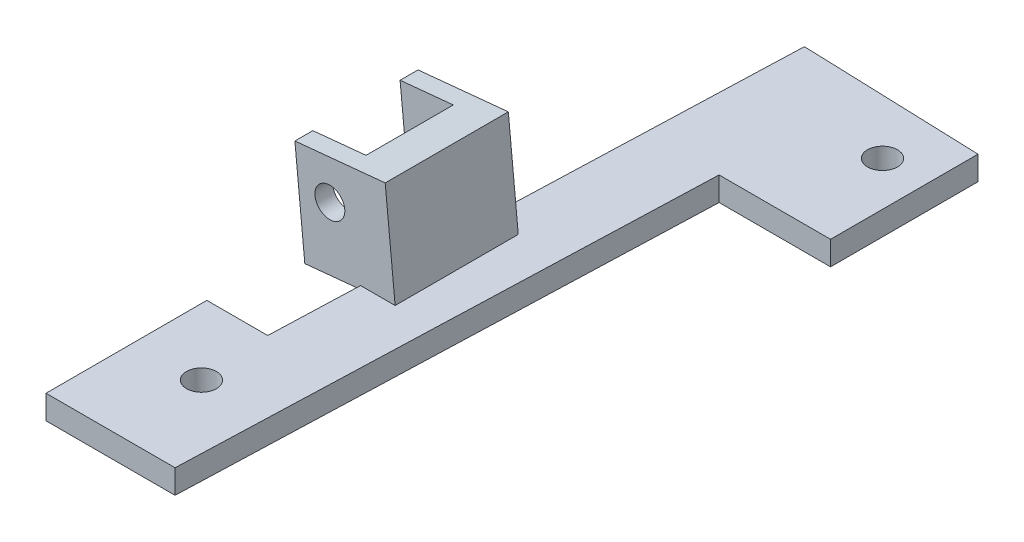
ISO-10303-21;
HEADER;
FILE_DESCRIPTION(('STEP AP214'),'2;1');
FILE_NAME('part.step','',(''),(''),'','','');
FILE_SCHEMA(('AUTOMOTIVE_DESIGN { 1 0 10303 214 1 1 1 1 }'));
ENDSEC;
DATA;
#1=APPLICATION_CONTEXT('core data for automotive mechanical design processes');
#2=APPLICATION_PROTOCOL_DEFINITION('international standard','automotive_design',2000,#1);
#3=PRODUCT_CONTEXT('',#1,'mechanical');
#4=PRODUCT('Part','Part','',(#3));
#5=PRODUCT_RELATED_PRODUCT_CATEGORY('part','',(#4));
#6=PRODUCT_DEFINITION_FORMATION('','',#4);
#7=PRODUCT_DEFINITION_CONTEXT('part definition',#1,'design');
#8=PRODUCT_DEFINITION('design','',#6,#7);
#9=PRODUCT_DEFINITION_SHAPE('','',#8);
#10=(LENGTH_UNIT() NAMED_UNIT(*) SI_UNIT(.MILLI.,.METRE.));
#11=(NAMED_UNIT(*) PLANE_ANGLE_UNIT() SI_UNIT($,.RADIAN.));
#12=(NAMED_UNIT(*) SI_UNIT($,.STERADIAN.) SOLID_ANGLE_UNIT());
#13=UNCERTAINTY_MEASURE_WITH_UNIT(LENGTH_MEASURE(1.E-05),#10,'distance_accuracy_value','');
#14=(GEOMETRIC_REPRESENTATION_CONTEXT(3) GLOBAL_UNCERTAINTY_ASSIGNED_CONTEXT((#13)) GLOBAL_UNIT_ASSIGNED_CONTEXT((#10,
#11,#12)) REPRESENTATION_CONTEXT('',''));
#15=CARTESIAN_POINT('',(0.,0.,0.));
#16=DIRECTION('',(0.,0.,1.));
#17=DIRECTION('',(1.,0.,0.));
#18=AXIS2_PLACEMENT_3D('',#15,#16,#17);
#19=CARTESIAN_POINT('',(484.354931301938,150.999999999998,-22.352));
#20=DIRECTION('',(0.,0.,1.));
#21=DIRECTION('',(1.,0.,0.));
#22=AXIS2_PLACEMENT_3D('',#19,#20,#21);
#23=CYLINDRICAL_SURFACE('',#22,9.52499999999996);
#24=CARTESIAN_POINT('',(484.354931301938,150.999999999998,-18.542));
#25=DIRECTION('',(0.,0.,-1.));
#26=DIRECTION('',(-1.,0.,0.));
#27=AXIS2_PLACEMENT_3D('',#24,#25,#26);
#28=CIRCLE('',#27,9.52499999999996);
#29=CARTESIAN_POINT('',(485.284620904235,141.520479851626,-18.542));
#30=VERTEX_POINT('',#29);
#31=CARTESIAN_POINT('',(488.231748541954,159.700339825977,-18.542));
#32=VERTEX_POINT('',#31);
#33=EDGE_CURVE('E286',#30,#32,#28,.F.);
#34=ORIENTED_EDGE('',*,*,#33,.F.);
#35=DIRECTION('',(0.,0.,1.));
#36=VECTOR('',#35,1.);
#37=CARTESIAN_POINT('',(485.284620904235,141.520479851626,-22.352));
#38=LINE('',#37,#36);
#39=CARTESIAN_POINT('',(485.284620904235,141.520479851626,0.));
#40=VERTEX_POINT('',#39);
#41=EDGE_CURVE('E308',#30,#40,#38,.T.);
#42=ORIENTED_EDGE('',*,*,#41,.T.);
#43=CARTESIAN_POINT('',(484.354931301938,150.999999999998,0.));
#44=DIRECTION('',(0.,0.,1.));
#45=DIRECTION('',(1.,0.,0.));
#46=AXIS2_PLACEMENT_3D('',#43,#44,#45);
#47=CIRCLE('',#46,9.52499999999996);
#48=CARTESIAN_POINT('',(488.231748541954,159.700339825977,4.44089209850063E-13));
#49=VERTEX_POINT('',#48);
#50=EDGE_CURVE('E295',#40,#49,#47,.T.);
#51=ORIENTED_EDGE('',*,*,#50,.T.);
#52=DIRECTION('',(0.,0.,1.));
#53=VECTOR('',#52,1.);
#54=CARTESIAN_POINT('',(488.231748541954,159.700339825977,-22.3519999999996));
#55=LINE('',#54,#53);
#56=EDGE_CURVE('E313',#32,#49,#55,.T.);
#57=ORIENTED_EDGE('',*,*,#56,.F.);
#58=EDGE_LOOP('',(#34,#42,#51,#57));
#59=FACE_BOUND('',#58,.T.);
#60=ADVANCED_FACE('F41',(#59),#23,.F.);
#61=CARTESIAN_POINT('',(-9.12398287906912,93.0321037493748,-22.352));
#62=DIRECTION('',(-0.0976052075901502,0.99522521242746,0.));
#63=DIRECTION('',(-0.99522521242746,-0.0976052075901502,0.));
#64=AXIS2_PLACEMENT_3D('',#61,#62,#63);
#65=PLANE('',#64);
#66=ORIENTED_EDGE('',*,*,#41,.F.);
#67=DIRECTION('',(0.995225212427461,0.0976052075901502,0.));
#68=VECTOR('',#67,1.);
#69=CARTESIAN_POINT('',(-9.12398287906916,93.0321037493748,-18.542));
#70=LINE('',#69,#68);
#71=CARTESIAN_POINT('',(478.661596160572,140.870936716155,-18.542));
#72=VERTEX_POINT('',#71);
#73=EDGE_CURVE('E288',#72,#30,#70,.T.);
#74=ORIENTED_EDGE('',*,*,#73,.F.);
#75=DIRECTION('',(0.,0.,1.));
#76=VECTOR('',#75,1.);
#77=CARTESIAN_POINT('',(478.661596160572,140.870936716155,-22.352));
#78=LINE('',#77,#76);
#79=CARTESIAN_POINT('',(478.661596160572,140.870936716155,0.));
#80=VERTEX_POINT('',#79);
#81=EDGE_CURVE('E322',#72,#80,#78,.T.);
#82=ORIENTED_EDGE('',*,*,#81,.T.);
#83=DIRECTION('',(-0.995225212427461,-0.0976052075901502,0.));
#84=VECTOR('',#83,1.);
#85=CARTESIAN_POINT('',(-9.12398287906912,93.0321037493748,0.));
#86=LINE('',#85,#84);
#87=EDGE_CURVE('E300',#40,#80,#86,.T.);
#88=ORIENTED_EDGE('',*,*,#87,.F.);
#89=EDGE_LOOP('',(#66,#74,#82,#88));
#90=FACE_BOUND('',#89,.T.);
#91=ADVANCED_FACE('F375',(#90),#65,.T.);
#92=CARTESIAN_POINT('',(-10.861882642295,110.752486746728,-22.352));
#93=DIRECTION('',(-0.0976052075901548,0.99522521242746,0.));
#94=DIRECTION('',(-0.99522521242746,-0.0976052075901548,0.));
#95=AXIS2_PLACEMENT_3D('',#92,#93,#94);
#96=PLANE('',#95);
#97=ORIENTED_EDGE('',*,*,#56,.T.);
#98=DIRECTION('',(-0.99522521242746,-0.0976052075901565,0.));
#99=VECTOR('',#98,1.);
#100=CARTESIAN_POINT('',(-10.8618826422952,110.752486746728,0.));
#101=LINE('',#100,#99);
#102=CARTESIAN_POINT('',(476.923696397346,158.591319713511,0.));
#103=VERTEX_POINT('',#102);
#104=EDGE_CURVE('E272',#49,#103,#101,.T.);
#105=ORIENTED_EDGE('',*,*,#104,.T.);
#106=DIRECTION('',(0.,0.,-1.));
#107=VECTOR('',#106,1.);
#108=CARTESIAN_POINT('',(476.923696397346,158.591319713511,3.81));
#109=LINE('',#108,#107);
#110=CARTESIAN_POINT('',(476.923696397346,158.591319713511,3.81));
#111=VERTEX_POINT('',#110);
#112=EDGE_CURVE('E269',#111,#103,#109,.T.);
#113=ORIENTED_EDGE('',*,*,#112,.F.);
#114=DIRECTION('',(-0.99522521242746,-0.0976052075901565,0.));
#115=VECTOR('',#114,1.);
#116=CARTESIAN_POINT('',(-10.8618826422952,110.752486746728,3.81));
#117=LINE('',#116,#115);
#118=CARTESIAN_POINT('',(496.114951182073,160.473473002825,3.81));
#119=VERTEX_POINT('',#118);
#120=EDGE_CURVE('E261',#119,#111,#117,.T.);
#121=ORIENTED_EDGE('',*,*,#120,.F.);
#122=DIRECTION('',(0.,0.,1.));
#123=VECTOR('',#122,1.);
#124=CARTESIAN_POINT('',(496.114951182073,160.473473002825,-22.352));
#125=LINE('',#124,#123);
#126=CARTESIAN_POINT('',(496.114951182073,160.473473002825,-22.352));
#127=VERTEX_POINT('',#126);
#128=EDGE_CURVE('E315',#127,#119,#125,.T.);
#129=ORIENTED_EDGE('',*,*,#128,.F.);
#130=DIRECTION('',(-0.99522521242746,-0.0976052075901548,0.));
#131=VECTOR('',#130,1.);
#132=CARTESIAN_POINT('',(-10.861882642295,110.752486746728,-22.352));
#133=LINE('',#132,#131);
#134=CARTESIAN_POINT('',(476.923696397346,158.591319713511,-22.352));
#135=VERTEX_POINT('',#134);
#136=EDGE_CURVE('E305',#127,#135,#133,.T.);
#137=ORIENTED_EDGE('',*,*,#136,.T.);
#138=DIRECTION('',(0.,0.,-1.));
#139=VECTOR('',#138,1.);
#140=CARTESIAN_POINT('',(476.923696397346,158.591319713511,-18.542));
#141=LINE('',#140,#139);
#142=CARTESIAN_POINT('',(476.923696397346,158.591319713511,-18.542));
#143=VERTEX_POINT('',#142);
#144=EDGE_CURVE('E290',#143,#135,#141,.T.);
#145=ORIENTED_EDGE('',*,*,#144,.F.);
#146=DIRECTION('',(-0.99522521242746,-0.0976052075901545,0.));
#147=VECTOR('',#146,1.);
#148=CARTESIAN_POINT('',(-10.8618826422951,110.752486746729,-18.542));
#149=LINE('',#148,#147);
#150=EDGE_CURVE('E284',#32,#143,#149,.T.);
#151=ORIENTED_EDGE('',*,*,#150,.F.);
#152=EDGE_LOOP('',(#97,#105,#113,#121,#129,#137,#145,#151));
#153=FACE_BOUND('',#152,.T.);
#154=ADVANCED_FACE('F365',(#153),#96,.T.);
#155=CARTESIAN_POINT('',(506.976833824368,49.7209862560963,-22.352));
#156=DIRECTION('',(0.99522521242746,0.0976052075901537,0.));
#157=DIRECTION('',(-0.0976052075901537,0.99522521242746,0.));
#158=AXIS2_PLACEMENT_3D('',#155,#156,#157);
#159=PLANE('',#158);
#160=ORIENTED_EDGE('',*,*,#128,.T.);
#161=DIRECTION('',(-0.0976052075901537,0.99522521242746,0.));
#162=VECTOR('',#161,1.);
#163=CARTESIAN_POINT('',(506.976833824368,49.7209862560963,3.81));
#164=LINE('',#163,#162);
#165=CARTESIAN_POINT('',(498.224726786217,138.961281946121,3.81));
#166=VERTEX_POINT('',#165);
#167=EDGE_CURVE('E257',#166,#119,#164,.T.);
#168=ORIENTED_EDGE('',*,*,#167,.F.);
#169=DIRECTION('',(0.,0.,1.));
#170=VECTOR('',#169,1.);
#171=CARTESIAN_POINT('',(498.224726786217,138.961281946121,-22.3520000000004));
#172=LINE('',#171,#170);
#173=CARTESIAN_POINT('',(498.224726786217,138.961281946121,-22.3520000000004));
#174=VERTEX_POINT('',#173);
#175=EDGE_CURVE('E317',#174,#166,#172,.T.);
#176=ORIENTED_EDGE('',*,*,#175,.F.);
#177=DIRECTION('',(-0.0976052075901537,0.99522521242746,0.));
#178=VECTOR('',#177,1.);
#179=CARTESIAN_POINT('',(506.976833824368,49.7209862560963,-22.352));
#180=LINE('',#179,#178);
#181=EDGE_CURVE('E302',#174,#127,#180,.T.);
#182=ORIENTED_EDGE('',*,*,#181,.T.);
#183=EDGE_LOOP('',(#160,#168,#176,#182));
#184=FACE_BOUND('',#183,.T.);
#185=ADVANCED_FACE('F408',(#184),#159,.T.);
#186=CARTESIAN_POINT('',(-8.75210703815077,89.2402956900246,-22.352));
#187=DIRECTION('',(0.0976052075901534,-0.99522521242746,0.));
#188=DIRECTION('',(0.99522521242746,0.0976052075901534,0.));
#189=AXIS2_PLACEMENT_3D('',#186,#187,#188);
#190=PLANE('',#189);
#191=DIRECTION('',(0.035071956284052,0.00343962907184407,-0.999378870516211));
#192=VECTOR('',#191,1.);
#193=CARTESIAN_POINT('',(491.171206664464,138.269518627499,-4.6390670309464));
#194=LINE('',#193,#192);
#195=CARTESIAN_POINT('',(490.874697184133,138.240438908638,3.81));
#196=VERTEX_POINT('',#195);
#197=CARTESIAN_POINT('',(491.792819977573,138.330482413091,-22.352));
#198=VERTEX_POINT('',#197);
#199=EDGE_CURVE('E249',#196,#198,#194,.T.);
#200=ORIENTED_EDGE('',*,*,#199,.F.);
#201=DIRECTION('',(0.99522521242746,0.0976052075901534,0.));
#202=VECTOR('',#201,1.);
#203=CARTESIAN_POINT('',(-8.75210703815082,89.2402956900246,3.81));
#204=LINE('',#203,#202);
#205=CARTESIAN_POINT('',(479.033472001491,137.079128656807,3.81));
#206=VERTEX_POINT('',#205);
#207=EDGE_CURVE('E266',#206,#196,#204,.T.);
#208=ORIENTED_EDGE('',*,*,#207,.F.);
#209=DIRECTION('',(0.,0.,1.));
#210=VECTOR('',#209,1.);
#211=CARTESIAN_POINT('',(479.033472001491,137.079128656807,-22.352));
#212=LINE('',#211,#210);
#213=CARTESIAN_POINT('',(479.033472001491,137.079128656807,-22.352));
#214=VERTEX_POINT('',#213);
#215=EDGE_CURVE('E320',#214,#206,#212,.T.);
#216=ORIENTED_EDGE('',*,*,#215,.F.);
#217=DIRECTION('',(0.99522521242746,0.0976052075901534,0.));
#218=VECTOR('',#217,1.);
#219=CARTESIAN_POINT('',(-8.75210703815077,89.2402956900246,-22.352));
#220=LINE('',#219,#218);
#221=EDGE_CURVE('E299',#214,#198,#220,.T.);
#222=ORIENTED_EDGE('',*,*,#221,.T.);
#223=EDGE_LOOP('',(#200,#208,#216,#222));
#224=FACE_BOUND('',#223,.T.);
#225=ADVANCED_FACE('F350',(#224),#190,.T.);
#226=CARTESIAN_POINT('',(487.785579039642,47.8388329667822,-22.352));
#227=DIRECTION('',(-0.99522521242746,-0.0976052075901538,0.));
#228=DIRECTION('',(0.0976052075901538,-0.99522521242746,0.));
#229=AXIS2_PLACEMENT_3D('',#226,#227,#228);
#230=PLANE('',#229);
#231=ORIENTED_EDGE('',*,*,#215,.T.);
#232=DIRECTION('',(0.0976052075901615,-0.995225212427459,0.));
#233=VECTOR('',#232,1.);
#234=CARTESIAN_POINT('',(487.785579039642,47.838832966786,3.81));
#235=LINE('',#234,#233);
#236=EDGE_CURVE('E263',#111,#206,#235,.T.);
#237=ORIENTED_EDGE('',*,*,#236,.F.);
#238=ORIENTED_EDGE('',*,*,#112,.T.);
#239=DIRECTION('',(0.0976052075901615,-0.995225212427459,0.));
#240=VECTOR('',#239,1.);
#241=CARTESIAN_POINT('',(487.785579039642,47.838832966786,0.));
#242=LINE('',#241,#240);
#243=EDGE_CURVE('E258',#103,#80,#242,.T.);
#244=ORIENTED_EDGE('',*,*,#243,.T.);
#245=ORIENTED_EDGE('',*,*,#81,.F.);
#246=DIRECTION('',(0.0976052075901549,-0.99522521242746,0.));
#247=VECTOR('',#246,1.);
#248=CARTESIAN_POINT('',(487.785579039642,47.8388329667827,-18.542));
#249=LINE('',#248,#247);
#250=EDGE_CURVE('E282',#143,#72,#249,.T.);
#251=ORIENTED_EDGE('',*,*,#250,.F.);
#252=ORIENTED_EDGE('',*,*,#144,.T.);
#253=DIRECTION('',(0.0976052075901538,-0.99522521242746,0.));
#254=VECTOR('',#253,1.);
#255=CARTESIAN_POINT('',(487.785579039642,47.8388329667822,-22.352));
#256=LINE('',#255,#254);
#257=EDGE_CURVE('E296',#135,#214,#256,.T.);
#258=ORIENTED_EDGE('',*,*,#257,.T.);
#259=EDGE_LOOP('',(#231,#237,#238,#244,#245,#251,#252,#258));
#260=FACE_BOUND('',#259,.T.);
#261=ADVANCED_FACE('F358',(#260),#230,.T.);
#262=CARTESIAN_POINT('',(0.,0.,-22.352));
#263=DIRECTION('',(0.,0.,1.));
#264=DIRECTION('',(1.,0.,0.));
#265=AXIS2_PLACEMENT_3D('',#262,#263,#264);
#266=PLANE('',#265);
#267=DIRECTION('',(-1.,0.,0.));
#268=VECTOR('',#267,1.);
#269=CARTESIAN_POINT('',(0.,138.961281946121,-22.352));
#270=LINE('',#269,#268);
#271=CARTESIAN_POINT('',(491.792819977573,138.961281946121,-22.352));
#272=VERTEX_POINT('',#271);
#273=EDGE_CURVE('E57',#174,#272,#270,.T.);
#274=ORIENTED_EDGE('',*,*,#273,.T.);
#275=DIRECTION('',(0.,-1.,0.));
#276=VECTOR('',#275,1.);
#277=CARTESIAN_POINT('',(491.792819977573,-3.70275009174436E-13,-22.352));
#278=LINE('',#277,#276);
#279=EDGE_CURVE('E61',#272,#198,#278,.T.);
#280=ORIENTED_EDGE('',*,*,#279,.T.);
#281=ORIENTED_EDGE('',*,*,#221,.F.);
#282=ORIENTED_EDGE('',*,*,#257,.F.);
#283=ORIENTED_EDGE('',*,*,#136,.F.);
#284=ORIENTED_EDGE('',*,*,#181,.F.);
#285=EDGE_LOOP('',(#274,#280,#281,#282,#283,#284));
#286=FACE_BOUND('',#285,.T.);
#287=CARTESIAN_POINT('',(484.354931301938,150.999999999998,-22.352));
#288=DIRECTION('',(0.,0.,-1.));
#289=DIRECTION('',(-1.,0.,0.));
#290=AXIS2_PLACEMENT_3D('',#287,#288,#289);
#291=CIRCLE('',#290,3.17499999999997);
#292=CARTESIAN_POINT('',(484.354931301938,154.174999999998,-22.352));
#293=VERTEX_POINT('',#292);
#294=EDGE_CURVE('E278',#293,#293,#291,.T.);
#295=ORIENTED_EDGE('',*,*,#294,.F.);
#296=EDGE_LOOP('',(#295));
#297=FACE_BOUND('',#296,.T.);
#298=ADVANCED_FACE('F360',(#286,#297),#266,.F.);
#299=CARTESIAN_POINT('',(484.354931301938,150.999999999998,-18.542));
#300=DIRECTION('',(0.,0.,-1.));
#301=DIRECTION('',(0.,1.,0.));
#302=AXIS2_PLACEMENT_3D('',#299,#300,#301);
#303=CYLINDRICAL_SURFACE('',#302,3.17499999999997);
#304=CARTESIAN_POINT('',(484.354931301938,150.999999999998,-18.542));
#305=DIRECTION('',(0.,0.,-1.));
#306=DIRECTION('',(-1.,0.,0.));
#307=AXIS2_PLACEMENT_3D('',#304,#305,#306);
#308=CIRCLE('',#307,3.17499999999997);
#309=CARTESIAN_POINT('',(484.354931301938,154.174999999998,-18.542));
#310=VERTEX_POINT('',#309);
#311=EDGE_CURVE('E279',#310,#310,#308,.T.);
#312=CARTESIAN_POINT('',(484.354931301938,154.174999999998,-18.542));
#313=CARTESIAN_POINT('',(484.354931301938,154.174999999998,-18.5816875));
#314=CARTESIAN_POINT('',(484.354931301938,154.174999999998,-18.621375));
#315=CARTESIAN_POINT('',(484.354931301938,154.174999999998,-18.70075));
#316=CARTESIAN_POINT('',(484.354931301938,154.174999999998,-18.7404375));
#317=CARTESIAN_POINT('',(484.354931301938,154.174999999998,-18.8198125));
#318=CARTESIAN_POINT('',(484.354931301938,154.174999999998,-18.8595));
#319=CARTESIAN_POINT('',(484.354931301938,154.174999999998,-18.938875));
#320=CARTESIAN_POINT('',(484.354931301938,154.174999999998,-18.9785625));
#321=CARTESIAN_POINT('',(484.354931301938,154.174999999998,-19.0579375));
#322=CARTESIAN_POINT('',(484.354931301938,154.174999999998,-19.097625));
#323=CARTESIAN_POINT('',(484.354931301938,154.174999999998,-19.177));
#324=CARTESIAN_POINT('',(484.354931301938,154.174999999998,-19.2166875));
#325=CARTESIAN_POINT('',(484.354931301938,154.174999999998,-19.2960625));
#326=CARTESIAN_POINT('',(484.354931301938,154.174999999998,-19.33575));
#327=CARTESIAN_POINT('',(484.354931301938,154.174999999998,-19.415125));
#328=CARTESIAN_POINT('',(484.354931301938,154.174999999998,-19.4548125));
#329=CARTESIAN_POINT('',(484.354931301938,154.174999999998,-19.5341875));
#330=CARTESIAN_POINT('',(484.354931301938,154.174999999998,-19.573875));
#331=CARTESIAN_POINT('',(484.354931301938,154.174999999998,-19.65325));
#332=CARTESIAN_POINT('',(484.354931301938,154.174999999998,-19.6929375));
#333=CARTESIAN_POINT('',(484.354931301938,154.174999999998,-19.7723125));
#334=CARTESIAN_POINT('',(484.354931301938,154.174999999998,-19.812));
#335=CARTESIAN_POINT('',(484.354931301938,154.174999999998,-19.891375));
#336=CARTESIAN_POINT('',(484.354931301938,154.174999999998,-19.9310625));
#337=CARTESIAN_POINT('',(484.354931301938,154.174999999998,-20.0104375));
#338=CARTESIAN_POINT('',(484.354931301938,154.174999999998,-20.050125));
#339=CARTESIAN_POINT('',(484.354931301938,154.174999999998,-20.1295));
#340=CARTESIAN_POINT('',(484.354931301938,154.174999999998,-20.1691875));
#341=CARTESIAN_POINT('',(484.354931301938,154.174999999998,-20.2485625));
#342=CARTESIAN_POINT('',(484.354931301938,154.174999999998,-20.28825));
#343=CARTESIAN_POINT('',(484.354931301938,154.174999999998,-20.367625));
#344=CARTESIAN_POINT('',(484.354931301938,154.174999999998,-20.4073125));
#345=CARTESIAN_POINT('',(484.354931301938,154.174999999998,-20.4866875));
#346=CARTESIAN_POINT('',(484.354931301938,154.174999999998,-20.526375));
#347=CARTESIAN_POINT('',(484.354931301938,154.174999999998,-20.60575));
#348=CARTESIAN_POINT('',(484.354931301938,154.174999999998,-20.6454375));
#349=CARTESIAN_POINT('',(484.354931301938,154.174999999998,-20.7248125));
#350=CARTESIAN_POINT('',(484.354931301938,154.174999999998,-20.7645));
#351=CARTESIAN_POINT('',(484.354931301938,154.174999999998,-20.843875));
#352=CARTESIAN_POINT('',(484.354931301938,154.174999999998,-20.8835625));
#353=CARTESIAN_POINT('',(484.354931301938,154.174999999998,-20.9629375));
#354=CARTESIAN_POINT('',(484.354931301938,154.174999999998,-21.002625));
#355=CARTESIAN_POINT('',(484.354931301938,154.174999999998,-21.082));
#356=CARTESIAN_POINT('',(484.354931301938,154.174999999998,-21.1216875));
#357=CARTESIAN_POINT('',(484.354931301938,154.174999999998,-21.2010625));
#358=CARTESIAN_POINT('',(484.354931301938,154.174999999998,-21.24075));
#359=CARTESIAN_POINT('',(484.354931301938,154.174999999998,-21.320125));
#360=CARTESIAN_POINT('',(484.354931301938,154.174999999998,-21.3598125));
#361=CARTESIAN_POINT('',(484.354931301938,154.174999999998,-21.4391875));
#362=CARTESIAN_POINT('',(484.354931301938,154.174999999998,-21.478875));
#363=CARTESIAN_POINT('',(484.354931301938,154.174999999998,-21.55825));
#364=CARTESIAN_POINT('',(484.354931301938,154.174999999998,-21.5979375));
#365=CARTESIAN_POINT('',(484.354931301938,154.174999999998,-21.6773125));
#366=CARTESIAN_POINT('',(484.354931301938,154.174999999998,-21.717));
#367=CARTESIAN_POINT('',(484.354931301938,154.174999999998,-21.796375));
#368=CARTESIAN_POINT('',(484.354931301938,154.174999999998,-21.8360625));
#369=CARTESIAN_POINT('',(484.354931301938,154.174999999998,-21.9154375));
#370=CARTESIAN_POINT('',(484.354931301938,154.174999999998,-21.955125));
#371=CARTESIAN_POINT('',(484.354931301938,154.174999999998,-22.0345));
#372=CARTESIAN_POINT('',(484.354931301938,154.174999999998,-22.0741875));
#373=CARTESIAN_POINT('',(484.354931301938,154.174999999998,-22.1535625));
#374=CARTESIAN_POINT('',(484.354931301938,154.174999999998,-22.19325));
#375=CARTESIAN_POINT('',(484.354931301938,154.174999999998,-22.272625));
#376=CARTESIAN_POINT('',(484.354931301938,154.174999999998,-22.3123125));
#377=CARTESIAN_POINT('',(484.354931301938,154.174999999998,-22.352));
#378=B_SPLINE_CURVE_WITH_KNOTS('',3,(#312,#313,#314,#315,#316,#317,#318,#319,#320,#321,#322,
#323,#324,#325,#326,#327,#328,#329,#330,#331,#332,#333,#334,#335,#336,#337,#338,#339,#340,#341,
#342,#343,#344,#345,#346,#347,#348,#349,#350,#351,#352,#353,#354,#355,#356,#357,#358,#359,#360,
#361,#362,#363,#364,#365,#366,#367,#368,#369,#370,#371,#372,#373,#374,#375,#376,#377),
.UNSPECIFIED.,.F.,.F.,(4,2,2,2,2,2,2,2,2,2,2,2,2,2,2,2,2,2,2,2,2,2,2,2,2,2,2,2,2,2,2,2,4),(0.,
0.119062500000003,0.238125000000002,0.357187500000002,0.476250000000001,0.5953125,
0.714375000000003,0.833437500000003,0.952500000000002,1.0715625,1.190625,1.3096875,1.42875,
1.5478125,1.666875,1.7859375,1.905,2.0240625,2.143125,2.2621875,2.38125,2.5003125,2.619375,
2.7384375,2.8575,2.9765625,3.095625,3.2146875,3.33375,3.4528125,3.571875,3.6909375,3.81),.UNSPECIFIED.);
#379=EDGE_CURVE('BSEAM398',#310,#293,#378,.T.);
#380=ORIENTED_EDGE('',*,*,#311,.F.);
#381=ORIENTED_EDGE('',*,*,#294,.T.);
#382=ORIENTED_EDGE('',*,*,#379,.T.);
#383=ORIENTED_EDGE('',*,*,#379,.F.);
#384=EDGE_LOOP('',(#380,#382,#381,#383));
#385=FACE_BOUND('',#384,.T.);
#386=ADVANCED_FACE('F398',(#385),#303,.F.);
#387=CARTESIAN_POINT('',(0.,0.,-18.542));
#388=DIRECTION('',(0.,0.,-1.));
#389=DIRECTION('',(-1.,0.,0.));
#390=AXIS2_PLACEMENT_3D('',#387,#388,#389);
#391=PLANE('',#390);
#392=ORIENTED_EDGE('',*,*,#311,.T.);
#393=EDGE_LOOP('',(#392));
#394=FACE_BOUND('',#393,.T.);
#395=ORIENTED_EDGE('',*,*,#250,.T.);
#396=ORIENTED_EDGE('',*,*,#73,.T.);
#397=ORIENTED_EDGE('',*,*,#33,.T.);
#398=ORIENTED_EDGE('',*,*,#150,.T.);
#399=EDGE_LOOP('',(#395,#396,#397,#398));
#400=FACE_BOUND('',#399,.T.);
#401=ADVANCED_FACE('F371',(#394,#400),#391,.F.);
#402=CARTESIAN_POINT('',(484.354931301938,150.999999999998,3.81));
#403=DIRECTION('',(0.,0.,-1.));
#404=DIRECTION('',(-1.,0.,0.));
#405=AXIS2_PLACEMENT_3D('',#402,#403,#404);
#406=CYLINDRICAL_SURFACE('',#405,3.17499999999997);
#407=CARTESIAN_POINT('',(484.354931301938,150.999999999998,3.81));
#408=DIRECTION('',(0.,0.,1.));
#409=DIRECTION('',(1.,0.,0.));
#410=AXIS2_PLACEMENT_3D('',#407,#408,#409);
#411=CIRCLE('',#410,3.17499999999997);
#412=CARTESIAN_POINT('',(481.179931301938,150.999999999998,3.81));
#413=VERTEX_POINT('',#412);
#414=EDGE_CURVE('E254',#413,#413,#411,.T.);
#415=CARTESIAN_POINT('',(484.354931301938,150.999999999998,0.));
#416=DIRECTION('',(0.,0.,1.));
#417=DIRECTION('',(1.,0.,0.));
#418=AXIS2_PLACEMENT_3D('',#415,#416,#417);
#419=CIRCLE('',#418,3.17499999999997);
#420=CARTESIAN_POINT('',(481.179931301938,150.999999999998,0.));
#421=VERTEX_POINT('',#420);
#422=EDGE_CURVE('E253',#421,#421,#419,.T.);
#423=CARTESIAN_POINT('',(481.179931301938,150.999999999998,3.81));
#424=CARTESIAN_POINT('',(481.179931301938,150.999999999998,3.7703125));
#425=CARTESIAN_POINT('',(481.179931301938,150.999999999998,3.730625));
#426=CARTESIAN_POINT('',(481.179931301938,150.999999999998,3.65125));
#427=CARTESIAN_POINT('',(481.179931301938,150.999999999998,3.6115625));
#428=CARTESIAN_POINT('',(481.179931301938,150.999999999998,3.5321875));
#429=CARTESIAN_POINT('',(481.179931301938,150.999999999998,3.4925));
#430=CARTESIAN_POINT('',(481.179931301938,150.999999999998,3.413125));
#431=CARTESIAN_POINT('',(481.179931301938,150.999999999998,3.3734375));
#432=CARTESIAN_POINT('',(481.179931301938,150.999999999998,3.2940625));
#433=CARTESIAN_POINT('',(481.179931301938,150.999999999998,3.254375));
#434=CARTESIAN_POINT('',(481.179931301938,150.999999999998,3.175));
#435=CARTESIAN_POINT('',(481.179931301938,150.999999999998,3.1353125));
#436=CARTESIAN_POINT('',(481.179931301938,150.999999999998,3.0559375));
#437=CARTESIAN_POINT('',(481.179931301938,150.999999999998,3.01625));
#438=CARTESIAN_POINT('',(481.179931301938,150.999999999998,2.936875));
#439=CARTESIAN_POINT('',(481.179931301938,150.999999999998,2.8971875));
#440=CARTESIAN_POINT('',(481.179931301938,150.999999999998,2.8178125));
#441=CARTESIAN_POINT('',(481.179931301938,150.999999999998,2.778125));
#442=CARTESIAN_POINT('',(481.179931301938,150.999999999998,2.69875));
#443=CARTESIAN_POINT('',(481.179931301938,150.999999999998,2.6590625));
#444=CARTESIAN_POINT('',(481.179931301938,150.999999999998,2.5796875));
#445=CARTESIAN_POINT('',(481.179931301938,150.999999999998,2.54));
#446=CARTESIAN_POINT('',(481.179931301938,150.999999999998,2.460625));
#447=CARTESIAN_POINT('',(481.179931301938,150.999999999998,2.4209375));
#448=CARTESIAN_POINT('',(481.179931301938,150.999999999998,2.3415625));
#449=CARTESIAN_POINT('',(481.179931301938,150.999999999998,2.301875));
#450=CARTESIAN_POINT('',(481.179931301938,150.999999999998,2.2225));
#451=CARTESIAN_POINT('',(481.179931301938,150.999999999998,2.1828125));
#452=CARTESIAN_POINT('',(481.179931301938,150.999999999998,2.1034375));
#453=CARTESIAN_POINT('',(481.179931301938,150.999999999998,2.06375));
#454=CARTESIAN_POINT('',(481.179931301938,150.999999999998,1.984375));
#455=CARTESIAN_POINT('',(481.179931301938,150.999999999998,1.9446875));
#456=CARTESIAN_POINT('',(481.179931301938,150.999999999998,1.8653125));
#457=CARTESIAN_POINT('',(481.179931301938,150.999999999998,1.825625));
#458=CARTESIAN_POINT('',(481.179931301938,150.999999999998,1.74625));
#459=CARTESIAN_POINT('',(481.179931301938,150.999999999998,1.7065625));
#460=CARTESIAN_POINT('',(481.179931301938,150.999999999998,1.6271875));
#461=CARTESIAN_POINT('',(481.179931301938,150.999999999998,1.5875));
#462=CARTESIAN_POINT('',(481.179931301938,150.999999999998,1.508125));
#463=CARTESIAN_POINT('',(481.179931301938,150.999999999998,1.4684375));
#464=CARTESIAN_POINT('',(481.179931301938,150.999999999998,1.3890625));
#465=CARTESIAN_POINT('',(481.179931301938,150.999999999998,1.349375));
#466=CARTESIAN_POINT('',(481.179931301938,150.999999999998,1.27));
#467=CARTESIAN_POINT('',(481.179931301938,150.999999999998,1.2303125));
#468=CARTESIAN_POINT('',(481.179931301938,150.999999999998,1.1509375));
#469=CARTESIAN_POINT('',(481.179931301938,150.999999999998,1.11125));
#470=CARTESIAN_POINT('',(481.179931301938,150.999999999998,1.031875));
#471=CARTESIAN_POINT('',(481.179931301938,150.999999999998,0.9921875));
#472=CARTESIAN_POINT('',(481.179931301938,150.999999999998,0.9128125));
#473=CARTESIAN_POINT('',(481.179931301938,150.999999999998,0.873125));
#474=CARTESIAN_POINT('',(481.179931301938,150.999999999998,0.79375));
#475=CARTESIAN_POINT('',(481.179931301938,150.999999999998,0.7540625));
#476=CARTESIAN_POINT('',(481.179931301938,150.999999999998,0.6746875));
#477=CARTESIAN_POINT('',(481.179931301938,150.999999999998,0.635));
#478=CARTESIAN_POINT('',(481.179931301938,150.999999999998,0.555625));
#479=CARTESIAN_POINT('',(481.179931301938,150.999999999998,0.5159375));
#480=CARTESIAN_POINT('',(481.179931301938,150.999999999998,0.4365625));
#481=CARTESIAN_POINT('',(481.179931301938,150.999999999998,0.396875));
#482=CARTESIAN_POINT('',(481.179931301938,150.999999999998,0.3175));
#483=CARTESIAN_POINT('',(481.179931301938,150.999999999998,0.2778125));
#484=CARTESIAN_POINT('',(481.179931301938,150.999999999998,0.1984375));
#485=CARTESIAN_POINT('',(481.179931301938,150.999999999998,0.15875));
#486=CARTESIAN_POINT('',(481.179931301938,150.999999999998,0.0793749999999999));
#487=CARTESIAN_POINT('',(481.179931301938,150.999999999998,0.0396874999999999));
#488=CARTESIAN_POINT('',(481.179931301938,150.999999999998,0.));
#489=B_SPLINE_CURVE_WITH_KNOTS('',3,(#423,#424,#425,#426,#427,#428,#429,#430,#431,#432,#433,
#434,#435,#436,#437,#438,#439,#440,#441,#442,#443,#444,#445,#446,#447,#448,#449,#450,#451,#452,
#453,#454,#455,#456,#457,#458,#459,#460,#461,#462,#463,#464,#465,#466,#467,#468,#469,#470,#471,
#472,#473,#474,#475,#476,#477,#478,#479,#480,#481,#482,#483,#484,#485,#486,#487,#488),
.UNSPECIFIED.,.F.,.F.,(4,2,2,2,2,2,2,2,2,2,2,2,2,2,2,2,2,2,2,2,2,2,2,2,2,2,2,2,2,2,2,2,4),(0.,
0.1190625,0.238125,0.3571875,0.47625,0.595312499999999,0.714375,0.833437499999999,
0.952499999999999,1.0715625,1.190625,1.3096875,1.42875,1.5478125,1.666875,1.7859375,1.905,
2.0240625,2.143125,2.2621875,2.38125,2.5003125,2.619375,2.7384375,2.8575,2.9765625,3.095625,
3.2146875,3.33375,3.4528125,3.571875,3.6909375,3.81),.UNSPECIFIED.);
#490=EDGE_CURVE('BSEAM388',#413,#421,#489,.T.);
#491=ORIENTED_EDGE('',*,*,#414,.T.);
#492=ORIENTED_EDGE('',*,*,#422,.F.);
#493=ORIENTED_EDGE('',*,*,#490,.T.);
#494=ORIENTED_EDGE('',*,*,#490,.F.);
#495=EDGE_LOOP('',(#491,#493,#492,#494));
#496=FACE_BOUND('',#495,.T.);
#497=ADVANCED_FACE('F388',(#496),#406,.F.);
#498=CARTESIAN_POINT('',(0.,0.,3.81));
#499=DIRECTION('',(0.,0.,1.));
#500=DIRECTION('',(1.,0.,0.));
#501=AXIS2_PLACEMENT_3D('',#498,#499,#500);
#502=PLANE('',#501);
#503=DIRECTION('',(0.,-1.,0.));
#504=VECTOR('',#503,1.);
#505=CARTESIAN_POINT('',(490.874697184133,-3.69583746691629E-13,3.81));
#506=LINE('',#505,#504);
#507=CARTESIAN_POINT('',(490.874697184133,138.961281946121,3.81));
#508=VERTEX_POINT('',#507);
#509=EDGE_CURVE('E11',#508,#196,#506,.T.);
#510=ORIENTED_EDGE('',*,*,#509,.F.);
#511=DIRECTION('',(-1.,0.,0.));
#512=VECTOR('',#511,1.);
#513=CARTESIAN_POINT('',(0.,138.961281946121,3.81));
#514=LINE('',#513,#512);
#515=EDGE_CURVE('E49',#166,#508,#514,.T.);
#516=ORIENTED_EDGE('',*,*,#515,.F.);
#517=ORIENTED_EDGE('',*,*,#167,.T.);
#518=ORIENTED_EDGE('',*,*,#120,.T.);
#519=ORIENTED_EDGE('',*,*,#236,.T.);
#520=ORIENTED_EDGE('',*,*,#207,.T.);
#521=EDGE_LOOP('',(#510,#516,#517,#518,#519,#520));
#522=FACE_BOUND('',#521,.T.);
#523=ORIENTED_EDGE('',*,*,#414,.F.);
#524=EDGE_LOOP('',(#523));
#525=FACE_BOUND('',#524,.T.);
#526=ADVANCED_FACE('F352',(#522,#525),#502,.T.);
#527=CARTESIAN_POINT('',(0.,0.,0.));
#528=DIRECTION('',(0.,0.,1.));
#529=DIRECTION('',(1.,0.,0.));
#530=AXIS2_PLACEMENT_3D('',#527,#528,#529);
#531=PLANE('',#530);
#532=ORIENTED_EDGE('',*,*,#50,.F.);
#533=ORIENTED_EDGE('',*,*,#87,.T.);
#534=ORIENTED_EDGE('',*,*,#243,.F.);
#535=ORIENTED_EDGE('',*,*,#104,.F.);
#536=EDGE_LOOP('',(#532,#533,#534,#535));
#537=FACE_BOUND('',#536,.T.);
#538=ORIENTED_EDGE('',*,*,#422,.T.);
#539=EDGE_LOOP('',(#538));
#540=FACE_BOUND('',#539,.T.);
#541=ADVANCED_FACE('F382',(#537,#540),#531,.F.);
#542=CARTESIAN_POINT('',(494.072487043271,133.881281946121,-87.3113389892222));
#543=DIRECTION('',(-0.999384782418439,0.,-0.0350721637548947));
#544=DIRECTION('',(-0.0350721637548947,0.,0.999384782418439));
#545=AXIS2_PLACEMENT_3D('',#542,#543,#544);
#546=PLANE('',#545);
#547=ORIENTED_EDGE('',*,*,#279,.F.);
#548=DIRECTION('',(-0.0350721637548947,0.,0.999384782418439));
#549=VECTOR('',#548,1.);
#550=CARTESIAN_POINT('',(494.072487043271,138.961281946121,-87.3113389892222));
#551=LINE('',#550,#549);
#552=CARTESIAN_POINT('',(494.072487043271,138.961281946121,-87.3113389892222));
#553=VERTEX_POINT('',#552);
#554=EDGE_CURVE('E217',#553,#272,#551,.T.);
#555=ORIENTED_EDGE('',*,*,#554,.F.);
#556=DIRECTION('',(0.,1.,0.));
#557=VECTOR('',#556,1.);
#558=CARTESIAN_POINT('',(494.072487043271,133.881281946121,-87.3113389892222));
#559=LINE('',#558,#557);
#560=CARTESIAN_POINT('',(494.072487043271,133.881281946121,-87.3113389892222));
#561=VERTEX_POINT('',#560);
#562=EDGE_CURVE('E193',#561,#553,#559,.T.);
#563=ORIENTED_EDGE('',*,*,#562,.F.);
#564=DIRECTION('',(-0.0350721637548947,0.,0.999384782418439));
#565=VECTOR('',#564,1.);
#566=CARTESIAN_POINT('',(494.072487043271,133.881281946121,-87.3113389892222));
#567=LINE('',#566,#565);
#568=CARTESIAN_POINT('',(490.206161169492,133.881281946121,22.8599999999999));
#569=VERTEX_POINT('',#568);
#570=EDGE_CURVE('E185',#561,#569,#567,.T.);
#571=ORIENTED_EDGE('',*,*,#570,.T.);
#572=DIRECTION('',(0.,1.,0.));
#573=VECTOR('',#572,1.);
#574=CARTESIAN_POINT('',(490.206161169492,133.881281946121,22.8599999999999));
#575=LINE('',#574,#573);
#576=CARTESIAN_POINT('',(490.206161169492,138.961281946121,22.8599999999999));
#577=VERTEX_POINT('',#576);
#578=EDGE_CURVE('E168',#569,#577,#575,.T.);
#579=ORIENTED_EDGE('',*,*,#578,.T.);
#580=EDGE_CURVE('E220',#508,#577,#551,.T.);
#581=ORIENTED_EDGE('',*,*,#580,.F.);
#582=ORIENTED_EDGE('',*,*,#509,.T.);
#583=ORIENTED_EDGE('',*,*,#199,.T.);
#584=EDGE_LOOP('',(#547,#555,#563,#571,#579,#581,#582,#583));
#585=FACE_BOUND('',#584,.T.);
#586=ADVANCED_FACE('F191',(#585),#546,.T.);
#587=CARTESIAN_POINT('',(0.,138.961281946121,3.88158721593413E-13));
#588=DIRECTION('',(0.,1.,0.));
#589=DIRECTION('',(0.,0.,1.));
#590=AXIS2_PLACEMENT_3D('',#587,#588,#589);
#591=PLANE('',#590);
#592=CARTESIAN_POINT('',(491.366130703707,138.961281946121,38.1050659351772));
#593=DIRECTION('',(0.,1.,0.));
#594=DIRECTION('',(0.,0.,1.));
#595=AXIS2_PLACEMENT_3D('',#592,#593,#594);
#596=CIRCLE('',#595,3.17500000000009);
#597=CARTESIAN_POINT('',(491.366130703707,138.961281946121,41.2800659351773));
#598=VERTEX_POINT('',#597);
#599=EDGE_CURVE('E328',#598,#598,#596,.T.);
#600=ORIENTED_EDGE('',*,*,#599,.F.);
#601=EDGE_LOOP('',(#600));
#602=FACE_BOUND('',#601,.T.);
#603=CARTESIAN_POINT('',(522.917143490395,138.961281946121,-75.0491676662665));
#604=DIRECTION('',(0.,1.,0.));
#605=DIRECTION('',(0.,0.,1.));
#606=AXIS2_PLACEMENT_3D('',#603,#604,#605);
#607=CIRCLE('',#606,3.17500000000008);
#608=CARTESIAN_POINT('',(522.917143490395,138.961281946121,-71.8741676662665));
#609=VERTEX_POINT('',#608);
#610=EDGE_CURVE('E200',#609,#609,#607,.T.);
#611=ORIENTED_EDGE('',*,*,#610,.F.);
#612=EDGE_LOOP('',(#611));
#613=FACE_BOUND('',#612,.T.);
#614=ORIENTED_EDGE('',*,*,#273,.F.);
#615=ORIENTED_EDGE('',*,*,#175,.T.);
#616=ORIENTED_EDGE('',*,*,#515,.T.);
#617=ORIENTED_EDGE('',*,*,#580,.T.);
#618=DIRECTION('',(-1.,0.,0.));
#619=VECTOR('',#618,1.);
#620=CARTESIAN_POINT('',(477.269374413565,138.961281946121,22.8599999999999));
#621=LINE('',#620,#619);
#622=CARTESIAN_POINT('',(477.269374413565,138.961281946121,22.8599999999999));
#623=VERTEX_POINT('',#622);
#624=EDGE_CURVE('E173',#577,#623,#621,.T.);
#625=ORIENTED_EDGE('',*,*,#624,.T.);
#626=DIRECTION('',(0.,0.,1.));
#627=VECTOR('',#626,1.);
#628=CARTESIAN_POINT('',(477.269374413565,138.961281946121,57.0385291686839));
#629=LINE('',#628,#627);
#630=CARTESIAN_POINT('',(477.269374413565,138.961281946121,57.0385291686839));
#631=VERTEX_POINT('',#630);
#632=EDGE_CURVE('E222',#623,#631,#629,.T.);
#633=ORIENTED_EDGE('',*,*,#632,.T.);
#634=DIRECTION('',(1.,0.,0.));
#635=VECTOR('',#634,1.);
#636=CARTESIAN_POINT('',(504.692489503563,138.961281946121,57.0385291686839));
#637=LINE('',#636,#635);
#638=CARTESIAN_POINT('',(504.692489503563,138.961281946121,57.0385291686839));
#639=VERTEX_POINT('',#638);
#640=EDGE_CURVE('E225',#631,#639,#637,.T.);
#641=ORIENTED_EDGE('',*,*,#640,.T.);
#642=DIRECTION('',(0.0350721637548938,0.,-0.999384782418439));
#643=VECTOR('',#642,1.);
#644=CARTESIAN_POINT('',(508.611718184172,138.961281946121,-54.6402805446749));
#645=LINE('',#644,#643);
#646=CARTESIAN_POINT('',(508.611718184172,138.961281946121,-54.6402805446749));
#647=VERTEX_POINT('',#646);
#648=EDGE_CURVE('E228',#639,#647,#645,.T.);
#649=ORIENTED_EDGE('',*,*,#648,.T.);
#650=DIRECTION('',(1.,0.,0.));
#651=VECTOR('',#650,1.);
#652=CARTESIAN_POINT('',(532.291432121368,138.961281946121,-54.6402805446749));
#653=LINE('',#652,#651);
#654=CARTESIAN_POINT('',(532.291432121368,138.961281946121,-54.6402805446749));
#655=VERTEX_POINT('',#654);
#656=EDGE_CURVE('E231',#647,#655,#653,.T.);
#657=ORIENTED_EDGE('',*,*,#656,.T.);
#658=DIRECTION('',(0.,0.,-1.));
#659=VECTOR('',#658,1.);
#660=CARTESIAN_POINT('',(532.291432121368,138.961281946121,-85.9700927306245));
#661=LINE('',#660,#659);
#662=CARTESIAN_POINT('',(532.291432121368,138.961281946121,-85.9700927306245));
#663=VERTEX_POINT('',#662);
#664=EDGE_CURVE('E197',#655,#663,#661,.T.);
#665=ORIENTED_EDGE('',*,*,#664,.T.);
#666=DIRECTION('',(-0.999384782418439,0.,-0.0350721637548908));
#667=VECTOR('',#666,1.);
#668=CARTESIAN_POINT('',(494.072487043271,138.961281946121,-87.3113389892222));
#669=LINE('',#668,#667);
#670=EDGE_CURVE('E194',#663,#553,#669,.T.);
#671=ORIENTED_EDGE('',*,*,#670,.T.);
#672=ORIENTED_EDGE('',*,*,#554,.T.);
#673=EDGE_LOOP('',(#614,#615,#616,#617,#625,#633,#641,#649,#657,#665,#671,#672));
#674=FACE_BOUND('',#673,.T.);
#675=ADVANCED_FACE('F341',(#602,#613,#674),#591,.T.);
#676=CARTESIAN_POINT('',(494.072487043271,133.881281946121,-87.3113389892222));
#677=DIRECTION('',(0.0350721637548908,0.,-0.999384782418439));
#678=DIRECTION('',(-0.999384782418439,0.,-0.0350721637548908));
#679=AXIS2_PLACEMENT_3D('',#676,#677,#678);
#680=PLANE('',#679);
#681=ORIENTED_EDGE('',*,*,#670,.F.);
#682=DIRECTION('',(0.,1.,0.));
#683=VECTOR('',#682,1.);
#684=CARTESIAN_POINT('',(532.291432121368,133.881281946121,-85.9700927306245));
#685=LINE('',#684,#683);
#686=CARTESIAN_POINT('',(532.291432121368,133.881281946121,-85.9700927306245));
#687=VERTEX_POINT('',#686);
#688=EDGE_CURVE('E237',#687,#663,#685,.T.);
#689=ORIENTED_EDGE('',*,*,#688,.F.);
#690=DIRECTION('',(-0.999384782418439,0.,-0.0350721637548908));
#691=VECTOR('',#690,1.);
#692=CARTESIAN_POINT('',(494.072487043271,133.881281946121,-87.3113389892222));
#693=LINE('',#692,#691);
#694=EDGE_CURVE('E178',#687,#561,#693,.T.);
#695=ORIENTED_EDGE('',*,*,#694,.T.);
#696=ORIENTED_EDGE('',*,*,#562,.T.);
#697=EDGE_LOOP('',(#681,#689,#695,#696));
#698=FACE_BOUND('',#697,.T.);
#699=ADVANCED_FACE('F344',(#698),#680,.T.);
#700=CARTESIAN_POINT('',(532.291432121368,133.881281946121,-85.9700927306245));
#701=DIRECTION('',(1.,0.,0.));
#702=DIRECTION('',(0.,1.,0.));
#703=AXIS2_PLACEMENT_3D('',#700,#701,#702);
#704=PLANE('',#703);
#705=ORIENTED_EDGE('',*,*,#664,.F.);
#706=DIRECTION('',(0.,1.,0.));
#707=VECTOR('',#706,1.);
#708=CARTESIAN_POINT('',(532.291432121368,133.881281946121,-54.6402805446749));
#709=LINE('',#708,#707);
#710=CARTESIAN_POINT('',(532.291432121368,133.881281946121,-54.6402805446749));
#711=VERTEX_POINT('',#710);
#712=EDGE_CURVE('E239',#711,#655,#709,.T.);
#713=ORIENTED_EDGE('',*,*,#712,.F.);
#714=DIRECTION('',(0.,0.,-1.));
#715=VECTOR('',#714,1.);
#716=CARTESIAN_POINT('',(532.291432121368,133.881281946121,-85.9700927306245));
#717=LINE('',#716,#715);
#718=EDGE_CURVE('E213',#711,#687,#717,.T.);
#719=ORIENTED_EDGE('',*,*,#718,.T.);
#720=ORIENTED_EDGE('',*,*,#688,.T.);
#721=EDGE_LOOP('',(#705,#713,#719,#720));
#722=FACE_BOUND('',#721,.T.);
#723=ADVANCED_FACE('F529',(#722),#704,.T.);
#724=CARTESIAN_POINT('',(532.291432121368,133.881281946121,-54.6402805446749));
#725=DIRECTION('',(0.,0.,1.));
#726=DIRECTION('',(0.,-1.,0.));
#727=AXIS2_PLACEMENT_3D('',#724,#725,#726);
#728=PLANE('',#727);
#729=ORIENTED_EDGE('',*,*,#656,.F.);
#730=DIRECTION('',(0.,1.,0.));
#731=VECTOR('',#730,1.);
#732=CARTESIAN_POINT('',(508.611718184172,133.881281946121,-54.6402805446749));
#733=LINE('',#732,#731);
#734=CARTESIAN_POINT('',(508.611718184172,133.881281946121,-54.6402805446749));
#735=VERTEX_POINT('',#734);
#736=EDGE_CURVE('E241',#735,#647,#733,.T.);
#737=ORIENTED_EDGE('',*,*,#736,.F.);
#738=DIRECTION('',(1.,0.,0.));
#739=VECTOR('',#738,1.);
#740=CARTESIAN_POINT('',(532.291432121368,133.881281946121,-54.6402805446749));
#741=LINE('',#740,#739);
#742=EDGE_CURVE('E210',#735,#711,#741,.T.);
#743=ORIENTED_EDGE('',*,*,#742,.T.);
#744=ORIENTED_EDGE('',*,*,#712,.T.);
#745=EDGE_LOOP('',(#729,#737,#743,#744));
#746=FACE_BOUND('',#745,.T.);
#747=ADVANCED_FACE('F539',(#746),#728,.T.);
#748=CARTESIAN_POINT('',(508.611718184172,133.881281946121,-54.6402805446749));
#749=DIRECTION('',(0.999384782418439,0.,0.0350721637548938));
#750=DIRECTION('',(0.0350721637548938,0.,-0.999384782418439));
#751=AXIS2_PLACEMENT_3D('',#748,#749,#750);
#752=PLANE('',#751);
#753=ORIENTED_EDGE('',*,*,#648,.F.);
#754=DIRECTION('',(0.,1.,0.));
#755=VECTOR('',#754,1.);
#756=CARTESIAN_POINT('',(504.692489503563,133.881281946121,57.0385291686839));
#757=LINE('',#756,#755);
#758=CARTESIAN_POINT('',(504.692489503563,133.881281946121,57.0385291686839));
#759=VERTEX_POINT('',#758);
#760=EDGE_CURVE('E243',#759,#639,#757,.T.);
#761=ORIENTED_EDGE('',*,*,#760,.F.);
#762=DIRECTION('',(0.0350721637548938,0.,-0.999384782418439));
#763=VECTOR('',#762,1.);
#764=CARTESIAN_POINT('',(508.611718184172,133.881281946121,-54.6402805446749));
#765=LINE('',#764,#763);
#766=EDGE_CURVE('E207',#759,#735,#765,.T.);
#767=ORIENTED_EDGE('',*,*,#766,.T.);
#768=ORIENTED_EDGE('',*,*,#736,.T.);
#769=EDGE_LOOP('',(#753,#761,#767,#768));
#770=FACE_BOUND('',#769,.T.);
#771=ADVANCED_FACE('F549',(#770),#752,.T.);
#772=CARTESIAN_POINT('',(504.692489503563,133.881281946121,57.0385291686839));
#773=DIRECTION('',(0.,0.,1.));
#774=DIRECTION('',(0.,-1.,0.));
#775=AXIS2_PLACEMENT_3D('',#772,#773,#774);
#776=PLANE('',#775);
#777=ORIENTED_EDGE('',*,*,#640,.F.);
#778=DIRECTION('',(0.,1.,0.));
#779=VECTOR('',#778,1.);
#780=CARTESIAN_POINT('',(477.269374413565,133.881281946121,57.0385291686839));
#781=LINE('',#780,#779);
#782=CARTESIAN_POINT('',(477.269374413565,133.881281946121,57.0385291686839));
#783=VERTEX_POINT('',#782);
#784=EDGE_CURVE('E245',#783,#631,#781,.T.);
#785=ORIENTED_EDGE('',*,*,#784,.F.);
#786=DIRECTION('',(1.,0.,0.));
#787=VECTOR('',#786,1.);
#788=CARTESIAN_POINT('',(504.692489503563,133.881281946121,57.0385291686839));
#789=LINE('',#788,#787);
#790=EDGE_CURVE('E204',#783,#759,#789,.T.);
#791=ORIENTED_EDGE('',*,*,#790,.T.);
#792=ORIENTED_EDGE('',*,*,#760,.T.);
#793=EDGE_LOOP('',(#777,#785,#791,#792));
#794=FACE_BOUND('',#793,.T.);
#795=ADVANCED_FACE('F559',(#794),#776,.T.);
#796=CARTESIAN_POINT('',(477.269374413565,133.881281946121,57.0385291686839));
#797=DIRECTION('',(-1.,0.,0.));
#798=DIRECTION('',(0.,-1.,0.));
#799=AXIS2_PLACEMENT_3D('',#796,#797,#798);
#800=PLANE('',#799);
#801=ORIENTED_EDGE('',*,*,#632,.F.);
#802=DIRECTION('',(0.,1.,0.));
#803=VECTOR('',#802,1.);
#804=CARTESIAN_POINT('',(477.269374413565,133.881281946121,22.8599999999999));
#805=LINE('',#804,#803);
#806=CARTESIAN_POINT('',(477.269374413565,133.881281946121,22.8599999999999));
#807=VERTEX_POINT('',#806);
#808=EDGE_CURVE('E177',#807,#623,#805,.T.);
#809=ORIENTED_EDGE('',*,*,#808,.F.);
#810=DIRECTION('',(0.,0.,1.));
#811=VECTOR('',#810,1.);
#812=CARTESIAN_POINT('',(477.269374413565,133.881281946121,57.0385291686839));
#813=LINE('',#812,#811);
#814=EDGE_CURVE('E189',#807,#783,#813,.T.);
#815=ORIENTED_EDGE('',*,*,#814,.T.);
#816=ORIENTED_EDGE('',*,*,#784,.T.);
#817=EDGE_LOOP('',(#801,#809,#815,#816));
#818=FACE_BOUND('',#817,.T.);
#819=ADVANCED_FACE('F569',(#818),#800,.T.);
#820=CARTESIAN_POINT('',(477.269374413565,133.881281946121,22.8599999999999));
#821=DIRECTION('',(0.,0.,-1.));
#822=DIRECTION('',(0.,1.,0.));
#823=AXIS2_PLACEMENT_3D('',#820,#821,#822);
#824=PLANE('',#823);
#825=ORIENTED_EDGE('',*,*,#624,.F.);
#826=ORIENTED_EDGE('',*,*,#578,.F.);
#827=DIRECTION('',(-1.,0.,0.));
#828=VECTOR('',#827,1.);
#829=CARTESIAN_POINT('',(477.269374413565,133.881281946121,22.8599999999999));
#830=LINE('',#829,#828);
#831=EDGE_CURVE('E171',#569,#807,#830,.T.);
#832=ORIENTED_EDGE('',*,*,#831,.T.);
#833=ORIENTED_EDGE('',*,*,#808,.T.);
#834=EDGE_LOOP('',(#825,#826,#832,#833));
#835=FACE_BOUND('',#834,.T.);
#836=ADVANCED_FACE('F170',(#835),#824,.T.);
#837=CARTESIAN_POINT('',(0.,133.881281946121,3.7371830300131E-13));
#838=DIRECTION('',(0.,1.,0.));
#839=DIRECTION('',(0.,0.,1.));
#840=AXIS2_PLACEMENT_3D('',#837,#838,#839);
#841=PLANE('',#840);
#842=CARTESIAN_POINT('',(491.366130703707,133.881281946121,38.1050659351772));
#843=DIRECTION('',(0.,1.,0.));
#844=DIRECTION('',(0.,0.,1.));
#845=AXIS2_PLACEMENT_3D('',#842,#843,#844);
#846=CIRCLE('',#845,3.17500000000009);
#847=CARTESIAN_POINT('',(491.366130703707,133.881281946121,41.2800659351773));
#848=VERTEX_POINT('',#847);
#849=EDGE_CURVE('E44',#848,#848,#846,.T.);
#850=ORIENTED_EDGE('',*,*,#849,.T.);
#851=EDGE_LOOP('',(#850));
#852=FACE_BOUND('',#851,.T.);
#853=CARTESIAN_POINT('',(522.917143490395,133.881281946121,-75.0491676662666));
#854=DIRECTION('',(0.,1.,0.));
#855=DIRECTION('',(0.,0.,1.));
#856=AXIS2_PLACEMENT_3D('',#853,#854,#855);
#857=CIRCLE('',#856,3.17500000000008);
#858=CARTESIAN_POINT('',(522.917143490395,133.881281946121,-71.8741676662665));
#859=VERTEX_POINT('',#858);
#860=EDGE_CURVE('E326',#859,#859,#857,.T.);
#861=ORIENTED_EDGE('',*,*,#860,.T.);
#862=EDGE_LOOP('',(#861));
#863=FACE_BOUND('',#862,.T.);
#864=ORIENTED_EDGE('',*,*,#570,.F.);
#865=ORIENTED_EDGE('',*,*,#694,.F.);
#866=ORIENTED_EDGE('',*,*,#718,.F.);
#867=ORIENTED_EDGE('',*,*,#742,.F.);
#868=ORIENTED_EDGE('',*,*,#766,.F.);
#869=ORIENTED_EDGE('',*,*,#790,.F.);
#870=ORIENTED_EDGE('',*,*,#814,.F.);
#871=ORIENTED_EDGE('',*,*,#831,.F.);
#872=EDGE_LOOP('',(#864,#865,#866,#867,#868,#869,#870,#871));
#873=FACE_BOUND('',#872,.T.);
#874=ADVANCED_FACE('F183',(#852,#863,#873),#841,.F.);
#875=CARTESIAN_POINT('',(522.917143490395,132.611281946121,-75.0491676662666));
#876=DIRECTION('',(0.,1.,0.));
#877=DIRECTION('',(0.,0.,1.));
#878=AXIS2_PLACEMENT_3D('',#875,#876,#877);
#879=CYLINDRICAL_SURFACE('',#878,3.17500000000008);
#880=ORIENTED_EDGE('',*,*,#610,.T.);
#881=EDGE_LOOP('',(#880));
#882=FACE_BOUND('',#881,.T.);
#883=ORIENTED_EDGE('',*,*,#860,.F.);
#884=EDGE_LOOP('',(#883));
#885=FACE_BOUND('',#884,.T.);
#886=ADVANCED_FACE('F338',(#882,#885),#879,.F.);
#887=CARTESIAN_POINT('',(491.366130703707,132.611281946121,38.1050659351772));
#888=DIRECTION('',(0.,1.,0.));
#889=DIRECTION('',(0.,0.,1.));
#890=AXIS2_PLACEMENT_3D('',#887,#888,#889);
#891=CYLINDRICAL_SURFACE('',#890,3.17500000000009);
#892=ORIENTED_EDGE('',*,*,#599,.T.);
#893=EDGE_LOOP('',(#892));
#894=FACE_BOUND('',#893,.T.);
#895=ORIENTED_EDGE('',*,*,#849,.F.);
#896=EDGE_LOOP('',(#895));
#897=FACE_BOUND('',#896,.T.);
#898=ADVANCED_FACE('F603',(#894,#897),#891,.F.);
#899=CLOSED_SHELL('',(#60,#91,#154,#185,#225,#261,#298,#386,#401,#497,#526,#541,#586,#675,#699,
#723,#747,#771,#795,#819,#836,#874,#886,#898));
#900=MANIFOLD_SOLID_BREP('B2',#899);
#901=ADVANCED_BREP_SHAPE_REPRESENTATION('',(#18,#900),#14);
#902=SHAPE_DEFINITION_REPRESENTATION(#9,#901);
ENDSEC;
END-ISO-10303-21;
